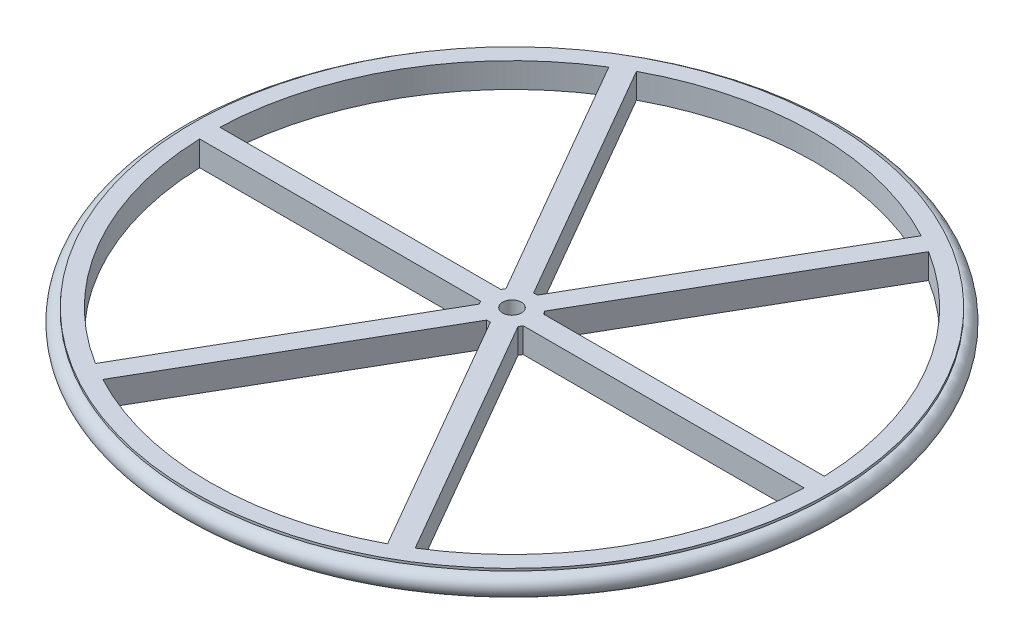
ISO-10303-21;
HEADER;
FILE_DESCRIPTION(('STEP AP214'),'2;1');
FILE_NAME('part.step','',(''),(''),'','','');
FILE_SCHEMA(('AUTOMOTIVE_DESIGN { 1 0 10303 214 1 1 1 1 }'));
ENDSEC;
DATA;
#1=APPLICATION_CONTEXT('core data for automotive mechanical design processes');
#2=APPLICATION_PROTOCOL_DEFINITION('international standard','automotive_design',2000,#1);
#3=PRODUCT_CONTEXT('',#1,'mechanical');
#4=PRODUCT('Part','Part','',(#3));
#5=PRODUCT_RELATED_PRODUCT_CATEGORY('part','',(#4));
#6=PRODUCT_DEFINITION_FORMATION('','',#4);
#7=PRODUCT_DEFINITION_CONTEXT('part definition',#1,'design');
#8=PRODUCT_DEFINITION('design','',#6,#7);
#9=PRODUCT_DEFINITION_SHAPE('','',#8);
#10=(LENGTH_UNIT() NAMED_UNIT(*) SI_UNIT(.MILLI.,.METRE.));
#11=(NAMED_UNIT(*) PLANE_ANGLE_UNIT() SI_UNIT($,.RADIAN.));
#12=(NAMED_UNIT(*) SI_UNIT($,.STERADIAN.) SOLID_ANGLE_UNIT());
#13=UNCERTAINTY_MEASURE_WITH_UNIT(LENGTH_MEASURE(1.E-05),#10,'distance_accuracy_value','');
#14=(GEOMETRIC_REPRESENTATION_CONTEXT(3) GLOBAL_UNCERTAINTY_ASSIGNED_CONTEXT((#13)) GLOBAL_UNIT_ASSIGNED_CONTEXT((#10,
#11,#12)) REPRESENTATION_CONTEXT('',''));
#15=CARTESIAN_POINT('',(0.,0.,0.));
#16=DIRECTION('',(0.,0.,1.));
#17=DIRECTION('',(1.,0.,0.));
#18=AXIS2_PLACEMENT_3D('',#15,#16,#17);
#19=CARTESIAN_POINT('',(0.,10.6,0.));
#20=DIRECTION('',(0.,-1.,0.));
#21=DIRECTION('',(0.,0.,-1.));
#22=AXIS2_PLACEMENT_3D('',#19,#20,#21);
#23=CYLINDRICAL_SURFACE('',#22,135.7);
#24=CARTESIAN_POINT('',(0.,0.999999999999997,0.));
#25=DIRECTION('',(0.,1.,0.));
#26=DIRECTION('',(0.,0.,1.));
#27=AXIS2_PLACEMENT_3D('',#24,#25,#26);
#28=CIRCLE('',#27,135.7);
#29=CARTESIAN_POINT('',(0.,0.999999999999997,135.7));
#30=VERTEX_POINT('',#29);
#31=EDGE_CURVE('E236',#30,#30,#28,.F.);
#32=ORIENTED_EDGE('',*,*,#31,.T.);
#33=EDGE_LOOP('',(#32));
#34=FACE_BOUND('',#33,.T.);
#35=CARTESIAN_POINT('',(0.,0.,0.));
#36=DIRECTION('',(0.,1.,0.));
#37=DIRECTION('',(0.,0.,1.));
#38=AXIS2_PLACEMENT_3D('',#35,#36,#37);
#39=CIRCLE('',#38,135.7);
#40=CARTESIAN_POINT('',(0.,0.,135.7));
#41=VERTEX_POINT('',#40);
#42=EDGE_CURVE('E43',#41,#41,#39,.T.);
#43=ORIENTED_EDGE('',*,*,#42,.T.);
#44=EDGE_LOOP('',(#43));
#45=FACE_BOUND('',#44,.T.);
#46=ADVANCED_FACE('F39',(#34,#45),#23,.T.);
#47=CARTESIAN_POINT('',(0.,10.6,0.));
#48=DIRECTION('',(0.,1.,0.));
#49=DIRECTION('',(0.,0.,1.));
#50=AXIS2_PLACEMENT_3D('',#47,#48,#49);
#51=PLANE('',#50);
#52=CARTESIAN_POINT('',(0.,10.6,0.));
#53=DIRECTION('',(0.,1.,0.));
#54=DIRECTION('',(0.,0.,1.));
#55=AXIS2_PLACEMENT_3D('',#52,#53,#54);
#56=CIRCLE('',#55,135.7);
#57=CARTESIAN_POINT('',(0.,10.6,135.7));
#58=VERTEX_POINT('',#57);
#59=EDGE_CURVE('E11',#58,#58,#56,.T.);
#60=ORIENTED_EDGE('',*,*,#59,.T.);
#61=EDGE_LOOP('',(#60));
#62=FACE_BOUND('',#61,.T.);
#63=CARTESIAN_POINT('',(0.,10.6,0.));
#64=DIRECTION('',(0.,1.,0.));
#65=DIRECTION('',(0.,0.,1.));
#66=AXIS2_PLACEMENT_3D('',#63,#64,#65);
#67=CIRCLE('',#66,4.);
#68=CARTESIAN_POINT('',(0.,10.6,4.));
#69=VERTEX_POINT('',#68);
#70=EDGE_CURVE('E467',#69,#69,#67,.T.);
#71=ORIENTED_EDGE('',*,*,#70,.F.);
#72=EDGE_LOOP('',(#71));
#73=FACE_BOUND('',#72,.T.);
#74=DIRECTION('',(-0.5,0.,-0.866025403784439));
#75=VECTOR('',#74,1.);
#76=CARTESIAN_POINT('',(-8.23805367348375,10.6,-5.66872751795329));
#77=LINE('',#76,#75);
#78=CARTESIAN_POINT('',(-8.23805367348375,10.6,-5.66872751795329));
#79=VERTEX_POINT('',#78);
#80=CARTESIAN_POINT('',(-67.9239092362731,10.6,-109.047661845922));
#81=VERTEX_POINT('',#80);
#82=EDGE_CURVE('E427',#79,#81,#77,.T.);
#83=ORIENTED_EDGE('',*,*,#82,.F.);
#84=CARTESIAN_POINT('',(0.,10.6,0.));
#85=DIRECTION('',(0.,-1.,0.));
#86=DIRECTION('',(0.,0.,1.));
#87=AXIS2_PLACEMENT_3D('',#84,#85,#86);
#88=CIRCLE('',#87,10.);
#89=CARTESIAN_POINT('',(-9.02828887442133,10.6,-4.3));
#90=VERTEX_POINT('',#89);
#91=EDGE_CURVE('E424',#90,#79,#88,.T.);
#92=ORIENTED_EDGE('',*,*,#91,.F.);
#93=DIRECTION('',(1.,0.,0.));
#94=VECTOR('',#93,1.);
#95=CARTESIAN_POINT('',(-9.02828887442133,10.6,-4.3));
#96=LINE('',#95,#94);
#97=CARTESIAN_POINT('',(-128.4,10.6,-4.3));
#98=VERTEX_POINT('',#97);
#99=EDGE_CURVE('E435',#98,#90,#96,.T.);
#100=ORIENTED_EDGE('',*,*,#99,.F.);
#101=CARTESIAN_POINT('',(0.,10.6,0.));
#102=DIRECTION('',(0.,1.,0.));
#103=DIRECTION('',(0.,0.,1.));
#104=AXIS2_PLACEMENT_3D('',#101,#102,#103);
#105=CIRCLE('',#104,128.471981381156);
#106=EDGE_CURVE('E431',#81,#98,#105,.T.);
#107=ORIENTED_EDGE('',*,*,#106,.F.);
#108=EDGE_LOOP('',(#83,#92,#100,#107));
#109=FACE_BOUND('',#108,.T.);
#110=DIRECTION('',(-1.,0.,0.));
#111=VECTOR('',#110,1.);
#112=CARTESIAN_POINT('',(-9.02828887442133,10.6,4.3));
#113=LINE('',#112,#111);
#114=CARTESIAN_POINT('',(-9.02828887442133,10.6,4.3));
#115=VERTEX_POINT('',#114);
#116=CARTESIAN_POINT('',(-128.4,10.6,4.3));
#117=VERTEX_POINT('',#116);
#118=EDGE_CURVE('E384',#115,#117,#113,.T.);
#119=ORIENTED_EDGE('',*,*,#118,.F.);
#120=CARTESIAN_POINT('',(0.,10.6,0.));
#121=DIRECTION('',(0.,-1.,0.));
#122=DIRECTION('',(0.,0.,1.));
#123=AXIS2_PLACEMENT_3D('',#120,#121,#122);
#124=CIRCLE('',#123,10.);
#125=CARTESIAN_POINT('',(-8.23805367348375,10.6,5.66872751795329));
#126=VERTEX_POINT('',#125);
#127=EDGE_CURVE('E381',#126,#115,#124,.T.);
#128=ORIENTED_EDGE('',*,*,#127,.F.);
#129=DIRECTION('',(0.499999999999999,0.,-0.866025403784439));
#130=VECTOR('',#129,1.);
#131=CARTESIAN_POINT('',(-8.23805367348375,10.6,5.66872751795329));
#132=LINE('',#131,#130);
#133=CARTESIAN_POINT('',(-67.923909236273,10.6,109.047661845922));
#134=VERTEX_POINT('',#133);
#135=EDGE_CURVE('E392',#134,#126,#132,.T.);
#136=ORIENTED_EDGE('',*,*,#135,.F.);
#137=CARTESIAN_POINT('',(0.,10.6,0.));
#138=DIRECTION('',(0.,1.,0.));
#139=DIRECTION('',(0.,0.,1.));
#140=AXIS2_PLACEMENT_3D('',#137,#138,#139);
#141=CIRCLE('',#140,128.471981381156);
#142=EDGE_CURVE('E388',#117,#134,#141,.T.);
#143=ORIENTED_EDGE('',*,*,#142,.F.);
#144=EDGE_LOOP('',(#119,#128,#136,#143));
#145=FACE_BOUND('',#144,.T.);
#146=DIRECTION('',(0.5,0.,-0.866025403784439));
#147=VECTOR('',#146,1.);
#148=CARTESIAN_POINT('',(0.790235200937577,10.6,-9.96872751795329));
#149=LINE('',#148,#147);
#150=CARTESIAN_POINT('',(0.790235200937577,10.6,-9.96872751795329));
#151=VERTEX_POINT('',#150);
#152=CARTESIAN_POINT('',(60.4760907637269,10.6,-113.347661845922));
#153=VERTEX_POINT('',#152);
#154=EDGE_CURVE('E341',#151,#153,#149,.T.);
#155=ORIENTED_EDGE('',*,*,#154,.F.);
#156=CARTESIAN_POINT('',(0.,10.6,0.));
#157=DIRECTION('',(0.,-1.,0.));
#158=DIRECTION('',(0.,0.,1.));
#159=AXIS2_PLACEMENT_3D('',#156,#157,#158);
#160=CIRCLE('',#159,10.);
#161=CARTESIAN_POINT('',(-0.79023520093758,10.6,-9.96872751795329));
#162=VERTEX_POINT('',#161);
#163=EDGE_CURVE('E338',#162,#151,#160,.T.);
#164=ORIENTED_EDGE('',*,*,#163,.F.);
#165=DIRECTION('',(0.5,0.,0.866025403784438));
#166=VECTOR('',#165,1.);
#167=CARTESIAN_POINT('',(-0.79023520093758,10.6,-9.96872751795329));
#168=LINE('',#167,#166);
#169=CARTESIAN_POINT('',(-60.4760907637269,10.6,-113.347661845922));
#170=VERTEX_POINT('',#169);
#171=EDGE_CURVE('E349',#170,#162,#168,.T.);
#172=ORIENTED_EDGE('',*,*,#171,.F.);
#173=CARTESIAN_POINT('',(0.,10.6,0.));
#174=DIRECTION('',(0.,1.,0.));
#175=DIRECTION('',(0.,0.,1.));
#176=AXIS2_PLACEMENT_3D('',#173,#174,#175);
#177=CIRCLE('',#176,128.471981381156);
#178=EDGE_CURVE('E345',#153,#170,#177,.T.);
#179=ORIENTED_EDGE('',*,*,#178,.F.);
#180=EDGE_LOOP('',(#155,#164,#172,#179));
#181=FACE_BOUND('',#180,.T.);
#182=DIRECTION('',(-0.5,0.,0.866025403784439));
#183=VECTOR('',#182,1.);
#184=CARTESIAN_POINT('',(8.23805367348375,10.6,-5.66872751795329));
#185=LINE('',#184,#183);
#186=CARTESIAN_POINT('',(67.9239092362731,10.6,-109.047661845922));
#187=VERTEX_POINT('',#186);
#188=CARTESIAN_POINT('',(8.23805367348375,10.6,-5.66872751795329));
#189=VERTEX_POINT('',#188);
#190=EDGE_CURVE('E298',#187,#189,#185,.T.);
#191=ORIENTED_EDGE('',*,*,#190,.F.);
#192=CARTESIAN_POINT('',(0.,10.6,0.));
#193=DIRECTION('',(0.,1.,0.));
#194=DIRECTION('',(0.,0.,-1.));
#195=AXIS2_PLACEMENT_3D('',#192,#193,#194);
#196=CIRCLE('',#195,128.471981381156);
#197=CARTESIAN_POINT('',(128.4,10.6,-4.30000000000002));
#198=VERTEX_POINT('',#197);
#199=EDGE_CURVE('E295',#198,#187,#196,.T.);
#200=ORIENTED_EDGE('',*,*,#199,.F.);
#201=DIRECTION('',(1.,0.,0.));
#202=VECTOR('',#201,1.);
#203=CARTESIAN_POINT('',(9.02828887442133,10.6,-4.3));
#204=LINE('',#203,#202);
#205=CARTESIAN_POINT('',(9.02828887442133,10.6,-4.3));
#206=VERTEX_POINT('',#205);
#207=EDGE_CURVE('E306',#206,#198,#204,.T.);
#208=ORIENTED_EDGE('',*,*,#207,.F.);
#209=CARTESIAN_POINT('',(0.,10.6,0.));
#210=DIRECTION('',(0.,-1.,0.));
#211=DIRECTION('',(0.,0.,1.));
#212=AXIS2_PLACEMENT_3D('',#209,#210,#211);
#213=CIRCLE('',#212,10.);
#214=EDGE_CURVE('E302',#189,#206,#213,.T.);
#215=ORIENTED_EDGE('',*,*,#214,.F.);
#216=EDGE_LOOP('',(#191,#200,#208,#215));
#217=FACE_BOUND('',#216,.T.);
#218=DIRECTION('',(0.5,0.,0.866025403784438));
#219=VECTOR('',#218,1.);
#220=CARTESIAN_POINT('',(8.23805367348375,10.6,5.66872751795328));
#221=LINE('',#220,#219);
#222=CARTESIAN_POINT('',(8.23805367348375,10.6,5.66872751795328));
#223=VERTEX_POINT('',#222);
#224=CARTESIAN_POINT('',(67.9239092362731,10.6,109.047661845922));
#225=VERTEX_POINT('',#224);
#226=EDGE_CURVE('E255',#223,#225,#221,.T.);
#227=ORIENTED_EDGE('',*,*,#226,.F.);
#228=CARTESIAN_POINT('',(0.,10.6,0.));
#229=DIRECTION('',(0.,-1.,0.));
#230=DIRECTION('',(0.,0.,1.));
#231=AXIS2_PLACEMENT_3D('',#228,#229,#230);
#232=CIRCLE('',#231,10.);
#233=CARTESIAN_POINT('',(9.02828887442133,10.6,4.3));
#234=VERTEX_POINT('',#233);
#235=EDGE_CURVE('E252',#234,#223,#232,.T.);
#236=ORIENTED_EDGE('',*,*,#235,.F.);
#237=DIRECTION('',(-1.,0.,0.));
#238=VECTOR('',#237,1.);
#239=CARTESIAN_POINT('',(9.02828887442133,10.6,4.3));
#240=LINE('',#239,#238);
#241=CARTESIAN_POINT('',(128.4,10.6,4.29999999999998));
#242=VERTEX_POINT('',#241);
#243=EDGE_CURVE('E263',#242,#234,#240,.T.);
#244=ORIENTED_EDGE('',*,*,#243,.F.);
#245=CARTESIAN_POINT('',(0.,10.6,0.));
#246=DIRECTION('',(0.,1.,0.));
#247=DIRECTION('',(0.,0.,-1.));
#248=AXIS2_PLACEMENT_3D('',#245,#246,#247);
#249=CIRCLE('',#248,128.471981381156);
#250=EDGE_CURVE('E259',#225,#242,#249,.T.);
#251=ORIENTED_EDGE('',*,*,#250,.F.);
#252=EDGE_LOOP('',(#227,#236,#244,#251));
#253=FACE_BOUND('',#252,.T.);
#254=DIRECTION('',(-0.499999999999999,0.,0.866025403784439));
#255=VECTOR('',#254,1.);
#256=CARTESIAN_POINT('',(-0.790235200937572,10.6,9.96872751795329));
#257=LINE('',#256,#255);
#258=CARTESIAN_POINT('',(-0.790235200937572,10.6,9.96872751795329));
#259=VERTEX_POINT('',#258);
#260=CARTESIAN_POINT('',(-60.4760907637268,10.6,113.347661845922));
#261=VERTEX_POINT('',#260);
#262=EDGE_CURVE('E210',#259,#261,#257,.T.);
#263=ORIENTED_EDGE('',*,*,#262,.F.);
#264=CARTESIAN_POINT('',(0.,10.6,0.));
#265=DIRECTION('',(0.,-1.,0.));
#266=DIRECTION('',(0.,0.,1.));
#267=AXIS2_PLACEMENT_3D('',#264,#265,#266);
#268=CIRCLE('',#267,10.);
#269=CARTESIAN_POINT('',(0.790235200937584,10.6,9.96872751795329));
#270=VERTEX_POINT('',#269);
#271=EDGE_CURVE('E201',#270,#259,#268,.T.);
#272=ORIENTED_EDGE('',*,*,#271,.F.);
#273=DIRECTION('',(-0.5,0.,-0.866025403784438));
#274=VECTOR('',#273,1.);
#275=CARTESIAN_POINT('',(0.790235200937584,10.6,9.96872751795329));
#276=LINE('',#275,#274);
#277=CARTESIAN_POINT('',(60.476090763727,10.6,113.347661845922));
#278=VERTEX_POINT('',#277);
#279=EDGE_CURVE('E228',#278,#270,#276,.T.);
#280=ORIENTED_EDGE('',*,*,#279,.F.);
#281=CARTESIAN_POINT('',(0.,10.6,0.));
#282=DIRECTION('',(0.,1.,0.));
#283=DIRECTION('',(0.,0.,-1.));
#284=AXIS2_PLACEMENT_3D('',#281,#282,#283);
#285=CIRCLE('',#284,128.471981381156);
#286=EDGE_CURVE('E224',#261,#278,#285,.T.);
#287=ORIENTED_EDGE('',*,*,#286,.F.);
#288=EDGE_LOOP('',(#263,#272,#280,#287));
#289=FACE_BOUND('',#288,.T.);
#290=ADVANCED_FACE('F223',(#62,#73,#109,#145,#181,#217,#253,#289),#51,.T.);
#291=CARTESIAN_POINT('',(0.,0.,0.));
#292=DIRECTION('',(0.,1.,0.));
#293=DIRECTION('',(0.,0.,1.));
#294=AXIS2_PLACEMENT_3D('',#291,#292,#293);
#295=PLANE('',#294);
#296=CARTESIAN_POINT('',(0.,0.,0.));
#297=DIRECTION('',(0.,-1.,0.));
#298=DIRECTION('',(0.,0.,1.));
#299=AXIS2_PLACEMENT_3D('',#296,#297,#298);
#300=CIRCLE('',#299,10.);
#301=CARTESIAN_POINT('',(9.02828887442133,0.,4.3));
#302=VERTEX_POINT('',#301);
#303=CARTESIAN_POINT('',(8.23805367348375,0.,5.66872751795328));
#304=VERTEX_POINT('',#303);
#305=EDGE_CURVE('E219',#302,#304,#300,.T.);
#306=ORIENTED_EDGE('',*,*,#305,.T.);
#307=DIRECTION('',(0.5,0.,0.866025403784438));
#308=VECTOR('',#307,1.);
#309=CARTESIAN_POINT('',(8.23805367348375,0.,5.66872751795328));
#310=LINE('',#309,#308);
#311=CARTESIAN_POINT('',(67.9239092362731,0.,109.047661845922));
#312=VERTEX_POINT('',#311);
#313=EDGE_CURVE('E270',#304,#312,#310,.T.);
#314=ORIENTED_EDGE('',*,*,#313,.T.);
#315=CARTESIAN_POINT('',(0.,0.,0.));
#316=DIRECTION('',(0.,1.,0.));
#317=DIRECTION('',(0.,0.,-1.));
#318=AXIS2_PLACEMENT_3D('',#315,#316,#317);
#319=CIRCLE('',#318,128.471981381156);
#320=CARTESIAN_POINT('',(128.4,0.,4.29999999999998));
#321=VERTEX_POINT('',#320);
#322=EDGE_CURVE('E274',#312,#321,#319,.T.);
#323=ORIENTED_EDGE('',*,*,#322,.T.);
#324=DIRECTION('',(-1.,0.,0.));
#325=VECTOR('',#324,1.);
#326=CARTESIAN_POINT('',(9.02828887442133,0.,4.3));
#327=LINE('',#326,#325);
#328=EDGE_CURVE('E256',#321,#302,#327,.T.);
#329=ORIENTED_EDGE('',*,*,#328,.T.);
#330=EDGE_LOOP('',(#306,#314,#323,#329));
#331=FACE_BOUND('',#330,.T.);
#332=CARTESIAN_POINT('',(0.,0.,0.));
#333=DIRECTION('',(0.,-1.,0.));
#334=DIRECTION('',(0.,0.,1.));
#335=AXIS2_PLACEMENT_3D('',#332,#333,#334);
#336=CIRCLE('',#335,10.);
#337=CARTESIAN_POINT('',(-0.79023520093758,0.,-9.96872751795329));
#338=VERTEX_POINT('',#337);
#339=CARTESIAN_POINT('',(0.790235200937577,0.,-9.96872751795329));
#340=VERTEX_POINT('',#339);
#341=EDGE_CURVE('E337',#338,#340,#336,.T.);
#342=ORIENTED_EDGE('',*,*,#341,.T.);
#343=DIRECTION('',(0.5,0.,-0.866025403784439));
#344=VECTOR('',#343,1.);
#345=CARTESIAN_POINT('',(0.790235200937577,0.,-9.96872751795329));
#346=LINE('',#345,#344);
#347=CARTESIAN_POINT('',(60.4760907637269,0.,-113.347661845922));
#348=VERTEX_POINT('',#347);
#349=EDGE_CURVE('E356',#340,#348,#346,.T.);
#350=ORIENTED_EDGE('',*,*,#349,.T.);
#351=CARTESIAN_POINT('',(0.,0.,0.));
#352=DIRECTION('',(0.,1.,0.));
#353=DIRECTION('',(0.,0.,1.));
#354=AXIS2_PLACEMENT_3D('',#351,#352,#353);
#355=CIRCLE('',#354,128.471981381156);
#356=CARTESIAN_POINT('',(-60.4760907637269,0.,-113.347661845922));
#357=VERTEX_POINT('',#356);
#358=EDGE_CURVE('E360',#348,#357,#355,.T.);
#359=ORIENTED_EDGE('',*,*,#358,.T.);
#360=DIRECTION('',(0.5,0.,0.866025403784438));
#361=VECTOR('',#360,1.);
#362=CARTESIAN_POINT('',(-0.79023520093758,0.,-9.96872751795329));
#363=LINE('',#362,#361);
#364=EDGE_CURVE('E342',#357,#338,#363,.T.);
#365=ORIENTED_EDGE('',*,*,#364,.T.);
#366=EDGE_LOOP('',(#342,#350,#359,#365));
#367=FACE_BOUND('',#366,.T.);
#368=CARTESIAN_POINT('',(0.,0.,0.));
#369=DIRECTION('',(0.,-1.,0.));
#370=DIRECTION('',(0.,0.,1.));
#371=AXIS2_PLACEMENT_3D('',#368,#369,#370);
#372=CIRCLE('',#371,10.);
#373=CARTESIAN_POINT('',(-9.02828887442133,0.,-4.3));
#374=VERTEX_POINT('',#373);
#375=CARTESIAN_POINT('',(-8.23805367348375,0.,-5.66872751795329));
#376=VERTEX_POINT('',#375);
#377=EDGE_CURVE('E423',#374,#376,#372,.T.);
#378=ORIENTED_EDGE('',*,*,#377,.T.);
#379=DIRECTION('',(-0.5,0.,-0.866025403784439));
#380=VECTOR('',#379,1.);
#381=CARTESIAN_POINT('',(-8.23805367348375,0.,-5.66872751795329));
#382=LINE('',#381,#380);
#383=CARTESIAN_POINT('',(-67.9239092362731,0.,-109.047661845922));
#384=VERTEX_POINT('',#383);
#385=EDGE_CURVE('E442',#376,#384,#382,.T.);
#386=ORIENTED_EDGE('',*,*,#385,.T.);
#387=CARTESIAN_POINT('',(0.,0.,0.));
#388=DIRECTION('',(0.,1.,0.));
#389=DIRECTION('',(0.,0.,1.));
#390=AXIS2_PLACEMENT_3D('',#387,#388,#389);
#391=CIRCLE('',#390,128.471981381156);
#392=CARTESIAN_POINT('',(-128.4,0.,-4.3));
#393=VERTEX_POINT('',#392);
#394=EDGE_CURVE('E446',#384,#393,#391,.T.);
#395=ORIENTED_EDGE('',*,*,#394,.T.);
#396=DIRECTION('',(1.,0.,0.));
#397=VECTOR('',#396,1.);
#398=CARTESIAN_POINT('',(-9.02828887442133,0.,-4.3));
#399=LINE('',#398,#397);
#400=EDGE_CURVE('E428',#393,#374,#399,.T.);
#401=ORIENTED_EDGE('',*,*,#400,.T.);
#402=EDGE_LOOP('',(#378,#386,#395,#401));
#403=FACE_BOUND('',#402,.T.);
#404=ORIENTED_EDGE('',*,*,#42,.F.);
#405=EDGE_LOOP('',(#404));
#406=FACE_BOUND('',#405,.T.);
#407=CARTESIAN_POINT('',(0.,0.,0.));
#408=DIRECTION('',(0.,1.,0.));
#409=DIRECTION('',(0.,0.,1.));
#410=AXIS2_PLACEMENT_3D('',#407,#408,#409);
#411=CIRCLE('',#410,4.);
#412=CARTESIAN_POINT('',(0.,0.,4.));
#413=VERTEX_POINT('',#412);
#414=EDGE_CURVE('E466',#413,#413,#411,.T.);
#415=ORIENTED_EDGE('',*,*,#414,.T.);
#416=EDGE_LOOP('',(#415));
#417=FACE_BOUND('',#416,.T.);
#418=CARTESIAN_POINT('',(0.,0.,0.));
#419=DIRECTION('',(0.,-1.,0.));
#420=DIRECTION('',(0.,0.,1.));
#421=AXIS2_PLACEMENT_3D('',#418,#419,#420);
#422=CIRCLE('',#421,10.);
#423=CARTESIAN_POINT('',(-8.23805367348375,0.,5.66872751795329));
#424=VERTEX_POINT('',#423);
#425=CARTESIAN_POINT('',(-9.02828887442133,0.,4.3));
#426=VERTEX_POINT('',#425);
#427=EDGE_CURVE('E380',#424,#426,#422,.T.);
#428=ORIENTED_EDGE('',*,*,#427,.T.);
#429=DIRECTION('',(-1.,0.,0.));
#430=VECTOR('',#429,1.);
#431=CARTESIAN_POINT('',(-9.02828887442133,0.,4.3));
#432=LINE('',#431,#430);
#433=CARTESIAN_POINT('',(-128.4,0.,4.3));
#434=VERTEX_POINT('',#433);
#435=EDGE_CURVE('E399',#426,#434,#432,.T.);
#436=ORIENTED_EDGE('',*,*,#435,.T.);
#437=CARTESIAN_POINT('',(0.,0.,0.));
#438=DIRECTION('',(0.,1.,0.));
#439=DIRECTION('',(0.,0.,1.));
#440=AXIS2_PLACEMENT_3D('',#437,#438,#439);
#441=CIRCLE('',#440,128.471981381156);
#442=CARTESIAN_POINT('',(-67.923909236273,0.,109.047661845922));
#443=VERTEX_POINT('',#442);
#444=EDGE_CURVE('E403',#434,#443,#441,.T.);
#445=ORIENTED_EDGE('',*,*,#444,.T.);
#446=DIRECTION('',(0.499999999999999,0.,-0.866025403784439));
#447=VECTOR('',#446,1.);
#448=CARTESIAN_POINT('',(-8.23805367348375,0.,5.66872751795329));
#449=LINE('',#448,#447);
#450=EDGE_CURVE('E385',#443,#424,#449,.T.);
#451=ORIENTED_EDGE('',*,*,#450,.T.);
#452=EDGE_LOOP('',(#428,#436,#445,#451));
#453=FACE_BOUND('',#452,.T.);
#454=CARTESIAN_POINT('',(0.,0.,0.));
#455=DIRECTION('',(0.,1.,0.));
#456=DIRECTION('',(0.,0.,-1.));
#457=AXIS2_PLACEMENT_3D('',#454,#455,#456);
#458=CIRCLE('',#457,128.471981381156);
#459=CARTESIAN_POINT('',(128.4,0.,-4.30000000000002));
#460=VERTEX_POINT('',#459);
#461=CARTESIAN_POINT('',(67.9239092362731,0.,-109.047661845922));
#462=VERTEX_POINT('',#461);
#463=EDGE_CURVE('E294',#460,#462,#458,.T.);
#464=ORIENTED_EDGE('',*,*,#463,.T.);
#465=DIRECTION('',(-0.5,0.,0.866025403784439));
#466=VECTOR('',#465,1.);
#467=CARTESIAN_POINT('',(8.23805367348375,0.,-5.66872751795329));
#468=LINE('',#467,#466);
#469=CARTESIAN_POINT('',(8.23805367348375,0.,-5.66872751795329));
#470=VERTEX_POINT('',#469);
#471=EDGE_CURVE('E313',#462,#470,#468,.T.);
#472=ORIENTED_EDGE('',*,*,#471,.T.);
#473=CARTESIAN_POINT('',(0.,0.,0.));
#474=DIRECTION('',(0.,-1.,0.));
#475=DIRECTION('',(0.,0.,1.));
#476=AXIS2_PLACEMENT_3D('',#473,#474,#475);
#477=CIRCLE('',#476,10.);
#478=CARTESIAN_POINT('',(9.02828887442133,0.,-4.3));
#479=VERTEX_POINT('',#478);
#480=EDGE_CURVE('E317',#470,#479,#477,.T.);
#481=ORIENTED_EDGE('',*,*,#480,.T.);
#482=DIRECTION('',(1.,0.,0.));
#483=VECTOR('',#482,1.);
#484=CARTESIAN_POINT('',(9.02828887442133,0.,-4.3));
#485=LINE('',#484,#483);
#486=EDGE_CURVE('E299',#479,#460,#485,.T.);
#487=ORIENTED_EDGE('',*,*,#486,.T.);
#488=EDGE_LOOP('',(#464,#472,#481,#487));
#489=FACE_BOUND('',#488,.T.);
#490=CARTESIAN_POINT('',(0.,0.,0.));
#491=DIRECTION('',(0.,-1.,0.));
#492=DIRECTION('',(0.,0.,1.));
#493=AXIS2_PLACEMENT_3D('',#490,#491,#492);
#494=CIRCLE('',#493,10.);
#495=CARTESIAN_POINT('',(0.790235200937584,0.,9.96872751795329));
#496=VERTEX_POINT('',#495);
#497=CARTESIAN_POINT('',(-0.790235200937572,0.,9.96872751795329));
#498=VERTEX_POINT('',#497);
#499=EDGE_CURVE('E63',#496,#498,#494,.T.);
#500=ORIENTED_EDGE('',*,*,#499,.T.);
#501=DIRECTION('',(-0.499999999999999,0.,0.866025403784439));
#502=VECTOR('',#501,1.);
#503=CARTESIAN_POINT('',(-0.790235200937572,0.,9.96872751795329));
#504=LINE('',#503,#502);
#505=CARTESIAN_POINT('',(-60.4760907637268,0.,113.347661845922));
#506=VERTEX_POINT('',#505);
#507=EDGE_CURVE('E217',#498,#506,#504,.T.);
#508=ORIENTED_EDGE('',*,*,#507,.T.);
#509=CARTESIAN_POINT('',(0.,0.,0.));
#510=DIRECTION('',(0.,1.,0.));
#511=DIRECTION('',(0.,0.,-1.));
#512=AXIS2_PLACEMENT_3D('',#509,#510,#511);
#513=CIRCLE('',#512,128.471981381156);
#514=CARTESIAN_POINT('',(60.476090763727,0.,113.347661845922));
#515=VERTEX_POINT('',#514);
#516=EDGE_CURVE('E239',#506,#515,#513,.T.);
#517=ORIENTED_EDGE('',*,*,#516,.T.);
#518=DIRECTION('',(-0.5,0.,-0.866025403784438));
#519=VECTOR('',#518,1.);
#520=CARTESIAN_POINT('',(0.790235200937584,0.,9.96872751795329));
#521=LINE('',#520,#519);
#522=EDGE_CURVE('E211',#515,#496,#521,.T.);
#523=ORIENTED_EDGE('',*,*,#522,.T.);
#524=EDGE_LOOP('',(#500,#508,#517,#523));
#525=FACE_BOUND('',#524,.T.);
#526=ADVANCED_FACE('F475',(#331,#367,#403,#406,#417,#453,#489,#525),#295,.F.);
#527=CARTESIAN_POINT('',(0.,9.6,0.));
#528=DIRECTION('',(0.,-1.,0.));
#529=DIRECTION('',(0.,0.,-1.));
#530=AXIS2_PLACEMENT_3D('',#527,#528,#529);
#531=CIRCLE('',#530,135.7);
#532=CARTESIAN_POINT('',(0.,9.6,-135.7));
#533=VERTEX_POINT('',#532);
#534=EDGE_CURVE('E619',#533,#533,#531,.F.);
#535=ORIENTED_EDGE('',*,*,#534,.T.);
#536=EDGE_LOOP('',(#535));
#537=FACE_BOUND('',#536,.T.);
#538=ORIENTED_EDGE('',*,*,#59,.F.);
#539=EDGE_LOOP('',(#538));
#540=FACE_BOUND('',#539,.T.);
#541=ADVANCED_FACE('F41',(#537,#540),#23,.T.);
#542=CARTESIAN_POINT('',(0.,10.6,0.));
#543=DIRECTION('',(0.,-1.,0.));
#544=DIRECTION('',(0.,0.,-1.));
#545=AXIS2_PLACEMENT_3D('',#542,#543,#544);
#546=CYLINDRICAL_SURFACE('',#545,4.);
#547=ORIENTED_EDGE('',*,*,#70,.T.);
#548=EDGE_LOOP('',(#547));
#549=FACE_BOUND('',#548,.T.);
#550=ORIENTED_EDGE('',*,*,#414,.F.);
#551=EDGE_LOOP('',(#550));
#552=FACE_BOUND('',#551,.T.);
#553=ADVANCED_FACE('F478',(#549,#552),#546,.F.);
#554=CARTESIAN_POINT('',(0.,10.6,0.));
#555=DIRECTION('',(0.,-1.,0.));
#556=DIRECTION('',(0.,0.,-1.));
#557=AXIS2_PLACEMENT_3D('',#554,#555,#556);
#558=CYLINDRICAL_SURFACE('',#557,10.);
#559=ORIENTED_EDGE('',*,*,#377,.F.);
#560=DIRECTION('',(0.,-1.,0.));
#561=VECTOR('',#560,1.);
#562=CARTESIAN_POINT('',(-9.02828887442133,10.6,-4.3));
#563=LINE('',#562,#561);
#564=EDGE_CURVE('E438',#90,#374,#563,.T.);
#565=ORIENTED_EDGE('',*,*,#564,.F.);
#566=ORIENTED_EDGE('',*,*,#91,.T.);
#567=DIRECTION('',(0.,-1.,0.));
#568=VECTOR('',#567,1.);
#569=CARTESIAN_POINT('',(-8.23805367348375,10.6,-5.66872751795329));
#570=LINE('',#569,#568);
#571=EDGE_CURVE('E462',#79,#376,#570,.T.);
#572=ORIENTED_EDGE('',*,*,#571,.T.);
#573=EDGE_LOOP('',(#559,#565,#566,#572));
#574=FACE_BOUND('',#573,.T.);
#575=ADVANCED_FACE('F480',(#574),#558,.T.);
#576=CARTESIAN_POINT('',(-8.23805367348375,10.6,-5.66872751795329));
#577=DIRECTION('',(-0.866025403784439,0.,0.5));
#578=DIRECTION('',(0.5,0.,0.866025403784439));
#579=AXIS2_PLACEMENT_3D('',#576,#577,#578);
#580=PLANE('',#579);
#581=ORIENTED_EDGE('',*,*,#385,.F.);
#582=ORIENTED_EDGE('',*,*,#571,.F.);
#583=ORIENTED_EDGE('',*,*,#82,.T.);
#584=DIRECTION('',(0.,-1.,0.));
#585=VECTOR('',#584,1.);
#586=CARTESIAN_POINT('',(-67.9239092362731,10.6,-109.047661845922));
#587=LINE('',#586,#585);
#588=EDGE_CURVE('E459',#81,#384,#587,.T.);
#589=ORIENTED_EDGE('',*,*,#588,.T.);
#590=EDGE_LOOP('',(#581,#582,#583,#589));
#591=FACE_BOUND('',#590,.T.);
#592=ADVANCED_FACE('F487',(#591),#580,.T.);
#593=CARTESIAN_POINT('',(0.,10.6,0.));
#594=DIRECTION('',(0.,-1.,0.));
#595=DIRECTION('',(0.,0.,-1.));
#596=AXIS2_PLACEMENT_3D('',#593,#594,#595);
#597=CYLINDRICAL_SURFACE('',#596,128.471981381156);
#598=ORIENTED_EDGE('',*,*,#394,.F.);
#599=ORIENTED_EDGE('',*,*,#588,.F.);
#600=ORIENTED_EDGE('',*,*,#106,.T.);
#601=DIRECTION('',(0.,-1.,0.));
#602=VECTOR('',#601,1.);
#603=CARTESIAN_POINT('',(-128.4,10.6,-4.3));
#604=LINE('',#603,#602);
#605=EDGE_CURVE('E456',#98,#393,#604,.T.);
#606=ORIENTED_EDGE('',*,*,#605,.T.);
#607=EDGE_LOOP('',(#598,#599,#600,#606));
#608=FACE_BOUND('',#607,.T.);
#609=ADVANCED_FACE('F526',(#608),#597,.F.);
#610=CARTESIAN_POINT('',(-9.02828887442133,10.6,-4.3));
#611=DIRECTION('',(0.,0.,-1.));
#612=DIRECTION('',(-1.,0.,0.));
#613=AXIS2_PLACEMENT_3D('',#610,#611,#612);
#614=PLANE('',#613);
#615=ORIENTED_EDGE('',*,*,#400,.F.);
#616=ORIENTED_EDGE('',*,*,#605,.F.);
#617=ORIENTED_EDGE('',*,*,#99,.T.);
#618=ORIENTED_EDGE('',*,*,#564,.T.);
#619=EDGE_LOOP('',(#615,#616,#617,#618));
#620=FACE_BOUND('',#619,.T.);
#621=ADVANCED_FACE('F516',(#620),#614,.T.);
#622=CARTESIAN_POINT('',(0.,10.6,0.));
#623=DIRECTION('',(0.,-1.,0.));
#624=DIRECTION('',(0.,0.,-1.));
#625=AXIS2_PLACEMENT_3D('',#622,#623,#624);
#626=CYLINDRICAL_SURFACE('',#625,10.);
#627=ORIENTED_EDGE('',*,*,#427,.F.);
#628=DIRECTION('',(0.,-1.,0.));
#629=VECTOR('',#628,1.);
#630=CARTESIAN_POINT('',(-8.23805367348375,10.6,5.66872751795329));
#631=LINE('',#630,#629);
#632=EDGE_CURVE('E395',#126,#424,#631,.T.);
#633=ORIENTED_EDGE('',*,*,#632,.F.);
#634=ORIENTED_EDGE('',*,*,#127,.T.);
#635=DIRECTION('',(0.,-1.,0.));
#636=VECTOR('',#635,1.);
#637=CARTESIAN_POINT('',(-9.02828887442133,10.6,4.3));
#638=LINE('',#637,#636);
#639=EDGE_CURVE('E419',#115,#426,#638,.T.);
#640=ORIENTED_EDGE('',*,*,#639,.T.);
#641=EDGE_LOOP('',(#627,#633,#634,#640));
#642=FACE_BOUND('',#641,.T.);
#643=ADVANCED_FACE('F533',(#642),#626,.T.);
#644=CARTESIAN_POINT('',(-9.02828887442133,10.6,4.3));
#645=DIRECTION('',(0.,0.,1.));
#646=DIRECTION('',(1.,0.,0.));
#647=AXIS2_PLACEMENT_3D('',#644,#645,#646);
#648=PLANE('',#647);
#649=ORIENTED_EDGE('',*,*,#435,.F.);
#650=ORIENTED_EDGE('',*,*,#639,.F.);
#651=ORIENTED_EDGE('',*,*,#118,.T.);
#652=DIRECTION('',(0.,-1.,0.));
#653=VECTOR('',#652,1.);
#654=CARTESIAN_POINT('',(-128.4,10.6,4.3));
#655=LINE('',#654,#653);
#656=EDGE_CURVE('E416',#117,#434,#655,.T.);
#657=ORIENTED_EDGE('',*,*,#656,.T.);
#658=EDGE_LOOP('',(#649,#650,#651,#657));
#659=FACE_BOUND('',#658,.T.);
#660=ADVANCED_FACE('F539',(#659),#648,.T.);
#661=CARTESIAN_POINT('',(0.,10.6,0.));
#662=DIRECTION('',(0.,-1.,0.));
#663=DIRECTION('',(0.,0.,-1.));
#664=AXIS2_PLACEMENT_3D('',#661,#662,#663);
#665=CYLINDRICAL_SURFACE('',#664,128.471981381156);
#666=ORIENTED_EDGE('',*,*,#444,.F.);
#667=ORIENTED_EDGE('',*,*,#656,.F.);
#668=ORIENTED_EDGE('',*,*,#142,.T.);
#669=DIRECTION('',(0.,-1.,0.));
#670=VECTOR('',#669,1.);
#671=CARTESIAN_POINT('',(-67.923909236273,10.6,109.047661845922));
#672=LINE('',#671,#670);
#673=EDGE_CURVE('E413',#134,#443,#672,.T.);
#674=ORIENTED_EDGE('',*,*,#673,.T.);
#675=EDGE_LOOP('',(#666,#667,#668,#674));
#676=FACE_BOUND('',#675,.T.);
#677=ADVANCED_FACE('F543',(#676),#665,.F.);
#678=CARTESIAN_POINT('',(-8.23805367348375,10.6,5.66872751795329));
#679=DIRECTION('',(-0.866025403784439,0.,-0.499999999999999));
#680=DIRECTION('',(-0.499999999999999,0.,0.866025403784439));
#681=AXIS2_PLACEMENT_3D('',#678,#679,#680);
#682=PLANE('',#681);
#683=ORIENTED_EDGE('',*,*,#450,.F.);
#684=ORIENTED_EDGE('',*,*,#673,.F.);
#685=ORIENTED_EDGE('',*,*,#135,.T.);
#686=ORIENTED_EDGE('',*,*,#632,.T.);
#687=EDGE_LOOP('',(#683,#684,#685,#686));
#688=FACE_BOUND('',#687,.T.);
#689=ADVANCED_FACE('F547',(#688),#682,.T.);
#690=CARTESIAN_POINT('',(0.,10.6,0.));
#691=DIRECTION('',(0.,-1.,0.));
#692=DIRECTION('',(0.,0.,-1.));
#693=AXIS2_PLACEMENT_3D('',#690,#691,#692);
#694=CYLINDRICAL_SURFACE('',#693,10.);
#695=ORIENTED_EDGE('',*,*,#341,.F.);
#696=DIRECTION('',(0.,-1.,0.));
#697=VECTOR('',#696,1.);
#698=CARTESIAN_POINT('',(-0.79023520093758,10.6,-9.96872751795329));
#699=LINE('',#698,#697);
#700=EDGE_CURVE('E352',#162,#338,#699,.T.);
#701=ORIENTED_EDGE('',*,*,#700,.F.);
#702=ORIENTED_EDGE('',*,*,#163,.T.);
#703=DIRECTION('',(0.,-1.,0.));
#704=VECTOR('',#703,1.);
#705=CARTESIAN_POINT('',(0.790235200937577,10.6,-9.96872751795329));
#706=LINE('',#705,#704);
#707=EDGE_CURVE('E376',#151,#340,#706,.T.);
#708=ORIENTED_EDGE('',*,*,#707,.T.);
#709=EDGE_LOOP('',(#695,#701,#702,#708));
#710=FACE_BOUND('',#709,.T.);
#711=ADVANCED_FACE('F551',(#710),#694,.T.);
#712=CARTESIAN_POINT('',(0.790235200937577,10.6,-9.96872751795329));
#713=DIRECTION('',(-0.866025403784439,0.,-0.5));
#714=DIRECTION('',(-0.5,0.,0.866025403784439));
#715=AXIS2_PLACEMENT_3D('',#712,#713,#714);
#716=PLANE('',#715);
#717=ORIENTED_EDGE('',*,*,#349,.F.);
#718=ORIENTED_EDGE('',*,*,#707,.F.);
#719=ORIENTED_EDGE('',*,*,#154,.T.);
#720=DIRECTION('',(0.,-1.,0.));
#721=VECTOR('',#720,1.);
#722=CARTESIAN_POINT('',(60.4760907637269,10.6,-113.347661845922));
#723=LINE('',#722,#721);
#724=EDGE_CURVE('E373',#153,#348,#723,.T.);
#725=ORIENTED_EDGE('',*,*,#724,.T.);
#726=EDGE_LOOP('',(#717,#718,#719,#725));
#727=FACE_BOUND('',#726,.T.);
#728=ADVANCED_FACE('F555',(#727),#716,.T.);
#729=CARTESIAN_POINT('',(0.,10.6,0.));
#730=DIRECTION('',(0.,-1.,0.));
#731=DIRECTION('',(0.,0.,-1.));
#732=AXIS2_PLACEMENT_3D('',#729,#730,#731);
#733=CYLINDRICAL_SURFACE('',#732,128.471981381156);
#734=ORIENTED_EDGE('',*,*,#358,.F.);
#735=ORIENTED_EDGE('',*,*,#724,.F.);
#736=ORIENTED_EDGE('',*,*,#178,.T.);
#737=DIRECTION('',(0.,-1.,0.));
#738=VECTOR('',#737,1.);
#739=CARTESIAN_POINT('',(-60.4760907637269,10.6,-113.347661845922));
#740=LINE('',#739,#738);
#741=EDGE_CURVE('E370',#170,#357,#740,.T.);
#742=ORIENTED_EDGE('',*,*,#741,.T.);
#743=EDGE_LOOP('',(#734,#735,#736,#742));
#744=FACE_BOUND('',#743,.T.);
#745=ADVANCED_FACE('F559',(#744),#733,.F.);
#746=CARTESIAN_POINT('',(-0.79023520093758,10.6,-9.96872751795329));
#747=DIRECTION('',(0.866025403784439,0.,-0.5));
#748=DIRECTION('',(-0.5,0.,-0.866025403784439));
#749=AXIS2_PLACEMENT_3D('',#746,#747,#748);
#750=PLANE('',#749);
#751=ORIENTED_EDGE('',*,*,#364,.F.);
#752=ORIENTED_EDGE('',*,*,#741,.F.);
#753=ORIENTED_EDGE('',*,*,#171,.T.);
#754=ORIENTED_EDGE('',*,*,#700,.T.);
#755=EDGE_LOOP('',(#751,#752,#753,#754));
#756=FACE_BOUND('',#755,.T.);
#757=ADVANCED_FACE('F563',(#756),#750,.T.);
#758=CARTESIAN_POINT('',(0.,10.6,0.));
#759=DIRECTION('',(0.,-1.,0.));
#760=DIRECTION('',(0.,0.,-1.));
#761=AXIS2_PLACEMENT_3D('',#758,#759,#760);
#762=CYLINDRICAL_SURFACE('',#761,128.471981381156);
#763=ORIENTED_EDGE('',*,*,#463,.F.);
#764=DIRECTION('',(0.,-1.,0.));
#765=VECTOR('',#764,1.);
#766=CARTESIAN_POINT('',(128.4,10.6,-4.30000000000002));
#767=LINE('',#766,#765);
#768=EDGE_CURVE('E309',#198,#460,#767,.T.);
#769=ORIENTED_EDGE('',*,*,#768,.F.);
#770=ORIENTED_EDGE('',*,*,#199,.T.);
#771=DIRECTION('',(0.,-1.,0.));
#772=VECTOR('',#771,1.);
#773=CARTESIAN_POINT('',(67.9239092362731,10.6,-109.047661845922));
#774=LINE('',#773,#772);
#775=EDGE_CURVE('E333',#187,#462,#774,.T.);
#776=ORIENTED_EDGE('',*,*,#775,.T.);
#777=EDGE_LOOP('',(#763,#769,#770,#776));
#778=FACE_BOUND('',#777,.T.);
#779=ADVANCED_FACE('F567',(#778),#762,.F.);
#780=CARTESIAN_POINT('',(8.23805367348375,10.6,-5.66872751795329));
#781=DIRECTION('',(0.866025403784439,0.,0.5));
#782=DIRECTION('',(0.5,0.,-0.866025403784439));
#783=AXIS2_PLACEMENT_3D('',#780,#781,#782);
#784=PLANE('',#783);
#785=ORIENTED_EDGE('',*,*,#471,.F.);
#786=ORIENTED_EDGE('',*,*,#775,.F.);
#787=ORIENTED_EDGE('',*,*,#190,.T.);
#788=DIRECTION('',(0.,-1.,0.));
#789=VECTOR('',#788,1.);
#790=CARTESIAN_POINT('',(8.23805367348375,10.6,-5.66872751795329));
#791=LINE('',#790,#789);
#792=EDGE_CURVE('E330',#189,#470,#791,.T.);
#793=ORIENTED_EDGE('',*,*,#792,.T.);
#794=EDGE_LOOP('',(#785,#786,#787,#793));
#795=FACE_BOUND('',#794,.T.);
#796=ADVANCED_FACE('F571',(#795),#784,.T.);
#797=CARTESIAN_POINT('',(0.,10.6,0.));
#798=DIRECTION('',(0.,-1.,0.));
#799=DIRECTION('',(0.,0.,-1.));
#800=AXIS2_PLACEMENT_3D('',#797,#798,#799);
#801=CYLINDRICAL_SURFACE('',#800,10.);
#802=ORIENTED_EDGE('',*,*,#480,.F.);
#803=ORIENTED_EDGE('',*,*,#792,.F.);
#804=ORIENTED_EDGE('',*,*,#214,.T.);
#805=DIRECTION('',(0.,-1.,0.));
#806=VECTOR('',#805,1.);
#807=CARTESIAN_POINT('',(9.02828887442133,10.6,-4.3));
#808=LINE('',#807,#806);
#809=EDGE_CURVE('E327',#206,#479,#808,.T.);
#810=ORIENTED_EDGE('',*,*,#809,.T.);
#811=EDGE_LOOP('',(#802,#803,#804,#810));
#812=FACE_BOUND('',#811,.T.);
#813=ADVANCED_FACE('F575',(#812),#801,.T.);
#814=CARTESIAN_POINT('',(9.02828887442133,10.6,-4.3));
#815=DIRECTION('',(0.,0.,-1.));
#816=DIRECTION('',(-1.,0.,0.));
#817=AXIS2_PLACEMENT_3D('',#814,#815,#816);
#818=PLANE('',#817);
#819=ORIENTED_EDGE('',*,*,#486,.F.);
#820=ORIENTED_EDGE('',*,*,#809,.F.);
#821=ORIENTED_EDGE('',*,*,#207,.T.);
#822=ORIENTED_EDGE('',*,*,#768,.T.);
#823=EDGE_LOOP('',(#819,#820,#821,#822));
#824=FACE_BOUND('',#823,.T.);
#825=ADVANCED_FACE('F579',(#824),#818,.T.);
#826=CARTESIAN_POINT('',(0.,10.6,0.));
#827=DIRECTION('',(0.,-1.,0.));
#828=DIRECTION('',(0.,0.,-1.));
#829=AXIS2_PLACEMENT_3D('',#826,#827,#828);
#830=CYLINDRICAL_SURFACE('',#829,10.);
#831=ORIENTED_EDGE('',*,*,#305,.F.);
#832=DIRECTION('',(0.,-1.,0.));
#833=VECTOR('',#832,1.);
#834=CARTESIAN_POINT('',(9.02828887442133,10.6,4.3));
#835=LINE('',#834,#833);
#836=EDGE_CURVE('E266',#234,#302,#835,.T.);
#837=ORIENTED_EDGE('',*,*,#836,.F.);
#838=ORIENTED_EDGE('',*,*,#235,.T.);
#839=DIRECTION('',(0.,-1.,0.));
#840=VECTOR('',#839,1.);
#841=CARTESIAN_POINT('',(8.23805367348375,10.6,5.66872751795328));
#842=LINE('',#841,#840);
#843=EDGE_CURVE('E290',#223,#304,#842,.T.);
#844=ORIENTED_EDGE('',*,*,#843,.T.);
#845=EDGE_LOOP('',(#831,#837,#838,#844));
#846=FACE_BOUND('',#845,.T.);
#847=ADVANCED_FACE('F583',(#846),#830,.T.);
#848=CARTESIAN_POINT('',(8.23805367348375,10.6,5.66872751795328));
#849=DIRECTION('',(0.866025403784438,0.,-0.5));
#850=DIRECTION('',(-0.5,0.,-0.866025403784438));
#851=AXIS2_PLACEMENT_3D('',#848,#849,#850);
#852=PLANE('',#851);
#853=ORIENTED_EDGE('',*,*,#313,.F.);
#854=ORIENTED_EDGE('',*,*,#843,.F.);
#855=ORIENTED_EDGE('',*,*,#226,.T.);
#856=DIRECTION('',(0.,-1.,0.));
#857=VECTOR('',#856,1.);
#858=CARTESIAN_POINT('',(67.9239092362731,10.6,109.047661845922));
#859=LINE('',#858,#857);
#860=EDGE_CURVE('E287',#225,#312,#859,.T.);
#861=ORIENTED_EDGE('',*,*,#860,.T.);
#862=EDGE_LOOP('',(#853,#854,#855,#861));
#863=FACE_BOUND('',#862,.T.);
#864=ADVANCED_FACE('F587',(#863),#852,.T.);
#865=CARTESIAN_POINT('',(0.,10.6,0.));
#866=DIRECTION('',(0.,-1.,0.));
#867=DIRECTION('',(0.,0.,-1.));
#868=AXIS2_PLACEMENT_3D('',#865,#866,#867);
#869=CYLINDRICAL_SURFACE('',#868,128.471981381156);
#870=ORIENTED_EDGE('',*,*,#322,.F.);
#871=ORIENTED_EDGE('',*,*,#860,.F.);
#872=ORIENTED_EDGE('',*,*,#250,.T.);
#873=DIRECTION('',(0.,-1.,0.));
#874=VECTOR('',#873,1.);
#875=CARTESIAN_POINT('',(128.4,10.6,4.29999999999998));
#876=LINE('',#875,#874);
#877=EDGE_CURVE('E284',#242,#321,#876,.T.);
#878=ORIENTED_EDGE('',*,*,#877,.T.);
#879=EDGE_LOOP('',(#870,#871,#872,#878));
#880=FACE_BOUND('',#879,.T.);
#881=ADVANCED_FACE('F591',(#880),#869,.F.);
#882=CARTESIAN_POINT('',(9.02828887442133,10.6,4.3));
#883=DIRECTION('',(0.,0.,1.));
#884=DIRECTION('',(1.,0.,0.));
#885=AXIS2_PLACEMENT_3D('',#882,#883,#884);
#886=PLANE('',#885);
#887=ORIENTED_EDGE('',*,*,#328,.F.);
#888=ORIENTED_EDGE('',*,*,#877,.F.);
#889=ORIENTED_EDGE('',*,*,#243,.T.);
#890=ORIENTED_EDGE('',*,*,#836,.T.);
#891=EDGE_LOOP('',(#887,#888,#889,#890));
#892=FACE_BOUND('',#891,.T.);
#893=ADVANCED_FACE('F595',(#892),#886,.T.);
#894=CARTESIAN_POINT('',(0.,10.6,0.));
#895=DIRECTION('',(0.,-1.,0.));
#896=DIRECTION('',(0.,0.,-1.));
#897=AXIS2_PLACEMENT_3D('',#894,#895,#896);
#898=CYLINDRICAL_SURFACE('',#897,10.);
#899=ORIENTED_EDGE('',*,*,#499,.F.);
#900=DIRECTION('',(0.,-1.,0.));
#901=VECTOR('',#900,1.);
#902=CARTESIAN_POINT('',(0.790235200937584,10.6,9.96872751795329));
#903=LINE('',#902,#901);
#904=EDGE_CURVE('E205',#270,#496,#903,.T.);
#905=ORIENTED_EDGE('',*,*,#904,.F.);
#906=ORIENTED_EDGE('',*,*,#271,.T.);
#907=DIRECTION('',(0.,-1.,0.));
#908=VECTOR('',#907,1.);
#909=CARTESIAN_POINT('',(-0.790235200937572,10.6,9.96872751795329));
#910=LINE('',#909,#908);
#911=EDGE_CURVE('E204',#259,#498,#910,.T.);
#912=ORIENTED_EDGE('',*,*,#911,.T.);
#913=EDGE_LOOP('',(#899,#905,#906,#912));
#914=FACE_BOUND('',#913,.T.);
#915=ADVANCED_FACE('F203',(#914),#898,.T.);
#916=CARTESIAN_POINT('',(-0.790235200937572,10.6,9.96872751795329));
#917=DIRECTION('',(0.866025403784439,0.,0.499999999999999));
#918=DIRECTION('',(0.499999999999999,0.,-0.866025403784439));
#919=AXIS2_PLACEMENT_3D('',#916,#917,#918);
#920=PLANE('',#919);
#921=ORIENTED_EDGE('',*,*,#507,.F.);
#922=ORIENTED_EDGE('',*,*,#911,.F.);
#923=ORIENTED_EDGE('',*,*,#262,.T.);
#924=DIRECTION('',(0.,-1.,0.));
#925=VECTOR('',#924,1.);
#926=CARTESIAN_POINT('',(-60.4760907637268,10.6,113.347661845922));
#927=LINE('',#926,#925);
#928=EDGE_CURVE('E220',#261,#506,#927,.T.);
#929=ORIENTED_EDGE('',*,*,#928,.T.);
#930=EDGE_LOOP('',(#921,#922,#923,#929));
#931=FACE_BOUND('',#930,.T.);
#932=ADVANCED_FACE('F214',(#931),#920,.T.);
#933=CARTESIAN_POINT('',(0.,10.6,0.));
#934=DIRECTION('',(0.,-1.,0.));
#935=DIRECTION('',(0.,0.,-1.));
#936=AXIS2_PLACEMENT_3D('',#933,#934,#935);
#937=CYLINDRICAL_SURFACE('',#936,128.471981381156);
#938=ORIENTED_EDGE('',*,*,#516,.F.);
#939=ORIENTED_EDGE('',*,*,#928,.F.);
#940=ORIENTED_EDGE('',*,*,#286,.T.);
#941=DIRECTION('',(0.,-1.,0.));
#942=VECTOR('',#941,1.);
#943=CARTESIAN_POINT('',(60.476090763727,10.6,113.347661845922));
#944=LINE('',#943,#942);
#945=EDGE_CURVE('E55',#278,#515,#944,.T.);
#946=ORIENTED_EDGE('',*,*,#945,.T.);
#947=EDGE_LOOP('',(#938,#939,#940,#946));
#948=FACE_BOUND('',#947,.T.);
#949=ADVANCED_FACE('F604',(#948),#937,.F.);
#950=CARTESIAN_POINT('',(0.790235200937584,10.6,9.96872751795329));
#951=DIRECTION('',(-0.866025403784438,0.,0.5));
#952=DIRECTION('',(0.500000000000001,0.,0.866025403784438));
#953=AXIS2_PLACEMENT_3D('',#950,#951,#952);
#954=PLANE('',#953);
#955=ORIENTED_EDGE('',*,*,#522,.F.);
#956=ORIENTED_EDGE('',*,*,#945,.F.);
#957=ORIENTED_EDGE('',*,*,#279,.T.);
#958=ORIENTED_EDGE('',*,*,#904,.T.);
#959=EDGE_LOOP('',(#955,#956,#957,#958));
#960=FACE_BOUND('',#959,.T.);
#961=ADVANCED_FACE('F607',(#960),#954,.T.);
#962=CARTESIAN_POINT('',(0.,5.3,0.));
#963=DIRECTION('',(0.,-1.,0.));
#964=DIRECTION('',(0.,0.,-1.));
#965=AXIS2_PLACEMENT_3D('',#962,#963,#964);
#966=TOROIDAL_SURFACE('',#965,135.7,4.3);
#967=ORIENTED_EDGE('',*,*,#31,.F.);
#968=EDGE_LOOP('',(#967));
#969=FACE_BOUND('',#968,.T.);
#970=ORIENTED_EDGE('',*,*,#534,.F.);
#971=EDGE_LOOP('',(#970));
#972=FACE_BOUND('',#971,.T.);
#973=ADVANCED_FACE('F611',(#969,#972),#966,.T.);
#974=CLOSED_SHELL('',(#46,#290,#526,#541,#553,#575,#592,#609,#621,#643,#660,#677,#689,#711,#728,
#745,#757,#779,#796,#813,#825,#847,#864,#881,#893,#915,#932,#949,#961,#973));
#975=MANIFOLD_SOLID_BREP('B2',#974);
#976=ADVANCED_BREP_SHAPE_REPRESENTATION('',(#18,#975),#14);
#977=SHAPE_DEFINITION_REPRESENTATION(#9,#976);
ENDSEC;
END-ISO-10303-21;
